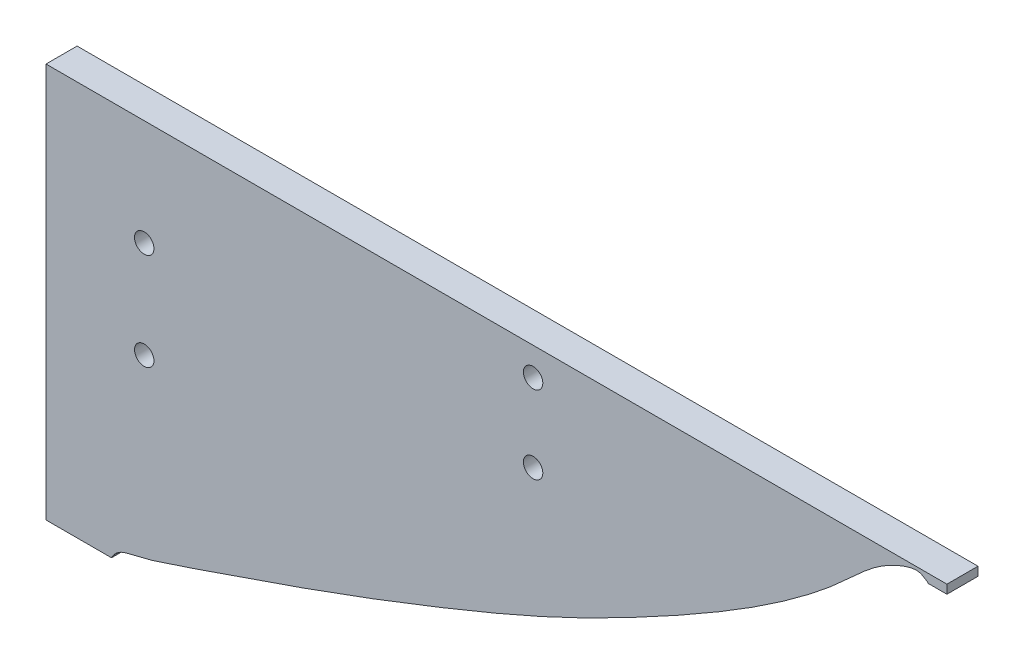
ISO-10303-21;
HEADER;
FILE_DESCRIPTION(('STEP AP214'),'2;1');
FILE_NAME('part.step','',(''),(''),'','','');
FILE_SCHEMA(('AUTOMOTIVE_DESIGN { 1 0 10303 214 1 1 1 1 }'));
ENDSEC;
DATA;
#1=APPLICATION_CONTEXT('core data for automotive mechanical design processes');
#2=APPLICATION_PROTOCOL_DEFINITION('international standard','automotive_design',2000,#1);
#3=PRODUCT_CONTEXT('',#1,'mechanical');
#4=PRODUCT('Part','Part','',(#3));
#5=PRODUCT_RELATED_PRODUCT_CATEGORY('part','',(#4));
#6=PRODUCT_DEFINITION_FORMATION('','',#4);
#7=PRODUCT_DEFINITION_CONTEXT('part definition',#1,'design');
#8=PRODUCT_DEFINITION('design','',#6,#7);
#9=PRODUCT_DEFINITION_SHAPE('','',#8);
#10=(LENGTH_UNIT() NAMED_UNIT(*) SI_UNIT(.MILLI.,.METRE.));
#11=(NAMED_UNIT(*) PLANE_ANGLE_UNIT() SI_UNIT($,.RADIAN.));
#12=(NAMED_UNIT(*) SI_UNIT($,.STERADIAN.) SOLID_ANGLE_UNIT());
#13=UNCERTAINTY_MEASURE_WITH_UNIT(LENGTH_MEASURE(1.E-05),#10,'distance_accuracy_value','');
#14=(GEOMETRIC_REPRESENTATION_CONTEXT(3) GLOBAL_UNCERTAINTY_ASSIGNED_CONTEXT((#13)) GLOBAL_UNIT_ASSIGNED_CONTEXT((#10,
#11,#12)) REPRESENTATION_CONTEXT('',''));
#15=CARTESIAN_POINT('',(0.,0.,0.));
#16=DIRECTION('',(0.,0.,1.));
#17=DIRECTION('',(1.,0.,0.));
#18=AXIS2_PLACEMENT_3D('',#15,#16,#17);
#19=CARTESIAN_POINT('',(1.38467628251213,-57.519694356409,156.));
#20=DIRECTION('',(0.,0.,-1.));
#21=DIRECTION('',(-1.,0.,0.));
#22=AXIS2_PLACEMENT_3D('',#19,#20,#21);
#23=PLANE('',#22);
#24=CARTESIAN_POINT('',(-100.,-50.,156.));
#25=DIRECTION('',(0.,0.,-1.));
#26=DIRECTION('',(-1.,0.,0.));
#27=AXIS2_PLACEMENT_3D('',#24,#25,#26);
#28=CIRCLE('',#27,2.5);
#29=CARTESIAN_POINT('',(-102.5,-50.,156.));
#30=VERTEX_POINT('',#29);
#31=EDGE_CURVE('E242',#30,#30,#28,.F.);
#32=ORIENTED_EDGE('',*,*,#31,.F.);
#33=EDGE_LOOP('',(#32));
#34=FACE_BOUND('',#33,.T.);
#35=CARTESIAN_POINT('',(0.0705666698621599,-4.96037406111782,156.));
#36=DIRECTION('',(0.,0.,-1.));
#37=DIRECTION('',(-1.,0.,0.));
#38=AXIS2_PLACEMENT_3D('',#35,#36,#37);
#39=CIRCLE('',#38,2.5);
#40=CARTESIAN_POINT('',(-2.42943333013784,-4.96037406111782,156.));
#41=VERTEX_POINT('',#40);
#42=EDGE_CURVE('E238',#41,#41,#39,.F.);
#43=ORIENTED_EDGE('',*,*,#42,.F.);
#44=EDGE_LOOP('',(#43));
#45=FACE_BOUND('',#44,.T.);
#46=CARTESIAN_POINT('',(101.738300139448,0.,156.));
#47=CARTESIAN_POINT('',(101.701496361419,0.06988973009756,156.));
#48=CARTESIAN_POINT('',(101.653650032581,0.133217944994193,156.));
#49=CARTESIAN_POINT('',(101.544895418378,0.24446647998401,156.));
#50=CARTESIAN_POINT('',(101.483294070726,0.293946423536007,156.));
#51=CARTESIAN_POINT('',(101.291066930551,0.430804283859788,156.));
#52=CARTESIAN_POINT('',(101.155515527028,0.509659958586335,156.));
#53=CARTESIAN_POINT('',(100.885753846964,0.669615509651436,156.));
#54=CARTESIAN_POINT('',(100.75259774972,0.752479417964117,156.));
#55=CARTESIAN_POINT('',(100.482899372572,0.912540898226803,156.));
#56=CARTESIAN_POINT('',(100.345639381759,0.988603464500231,156.));
#57=CARTESIAN_POINT('',(100.063852301763,1.12830204575235,156.));
#58=CARTESIAN_POINT('',(99.9210179481655,1.19185210345175,156.));
#59=CARTESIAN_POINT('',(99.6279774840183,1.29502595714121,156.));
#60=CARTESIAN_POINT('',(99.477461202732,1.33364304248169,156.));
#61=CARTESIAN_POINT('',(99.1692964096003,1.38772837414857,156.));
#62=CARTESIAN_POINT('',(99.0112200347358,1.4031052945355,156.));
#63=CARTESIAN_POINT('',(98.6988570431695,1.41462659462545,156.));
#64=CARTESIAN_POINT('',(98.5432363651441,1.41109384861551,156.));
#65=CARTESIAN_POINT('',(98.0775590466803,1.38086350862981,156.));
#66=CARTESIAN_POINT('',(97.7679244188163,1.33493500583158,156.));
#67=CARTESIAN_POINT('',(97.1535321885674,1.21574105479129,156.));
#68=CARTESIAN_POINT('',(96.8508770142768,1.14387408795452,156.));
#69=CARTESIAN_POINT('',(95.9546967782744,0.896428384166549,156.));
#70=CARTESIAN_POINT('',(95.372911997121,0.689126454648643,156.));
#71=CARTESIAN_POINT('',(94.2238206411409,0.235401305023569,156.));
#72=CARTESIAN_POINT('',(93.6569799005288,-0.0122806370038444,156.));
#73=CARTESIAN_POINT('',(92.5371792416302,-0.545151631509203,156.));
#74=CARTESIAN_POINT('',(91.9836040653176,-0.830085799385408,156.));
#75=CARTESIAN_POINT('',(90.360358855196,-1.72532159182748,156.));
#76=CARTESIAN_POINT('',(89.3225671754566,-2.38073907298001,156.));
#77=CARTESIAN_POINT('',(86.3383460725468,-4.51754122780541,156.));
#78=CARTESIAN_POINT('',(84.5115464224696,-6.15689881237222,156.));
#79=CARTESIAN_POINT('',(81.7996498653415,-8.65330961722393,156.));
#80=CARTESIAN_POINT('',(80.8992938738056,-9.49018881707652,156.));
#81=CARTESIAN_POINT('',(79.081527180443,-11.1417224289756,156.));
#82=CARTESIAN_POINT('',(78.1659599858207,-11.9587949893637,156.));
#83=CARTESIAN_POINT('',(75.3834025951578,-14.3633719941032,156.));
#84=CARTESIAN_POINT('',(73.4783512478766,-15.901367084239,156.));
#85=CARTESIAN_POINT('',(69.6022773876519,-18.8915429971448,156.));
#86=CARTESIAN_POINT('',(67.6316513689175,-20.344239573422,156.));
#87=CARTESIAN_POINT('',(63.641475930029,-23.1859939254836,156.));
#88=CARTESIAN_POINT('',(61.6212706236731,-24.5741985346864,156.));
#89=CARTESIAN_POINT('',(57.5306040541092,-27.2852355851952,156.));
#90=CARTESIAN_POINT('',(55.4613177881015,-28.6084261149727,156.));
#91=CARTESIAN_POINT('',(51.2917632403158,-31.1992421302028,156.));
#92=CARTESIAN_POINT('',(49.1904842273012,-32.4677513343181,156.));
#93=CARTESIAN_POINT('',(44.9643798012462,-34.9663877282194,156.));
#94=CARTESIAN_POINT('',(42.8394776411478,-36.1962370655212,156.));
#95=CARTESIAN_POINT('',(36.4374256172386,-39.8354492264472,156.));
#96=CARTESIAN_POINT('',(32.1311178506682,-42.195499281144,156.));
#97=CARTESIAN_POINT('',(23.46111164709,-46.8016861693649,156.));
#98=CARTESIAN_POINT('',(19.0982984410697,-49.049764622174,156.));
#99=CARTESIAN_POINT('',(10.2995504860633,-53.401269748828,156.));
#100=CARTESIAN_POINT('',(5.85967663575825,-55.5009424117576,156.));
#101=CARTESIAN_POINT('',(-3.09032407073432,-59.5384463010606,156.));
#102=CARTESIAN_POINT('',(-7.59938739338839,-61.4775148103721,156.));
#103=CARTESIAN_POINT('',(-16.661176991931,-65.2535111709338,156.));
#104=CARTESIAN_POINT('',(-21.2127032080176,-67.0942874665058,156.));
#105=CARTESIAN_POINT('',(-30.3380342543462,-70.7181338355998,156.));
#106=CARTESIAN_POINT('',(-34.9125126821509,-72.4993157921662,156.));
#107=CARTESIAN_POINT('',(-44.0895554117789,-75.9885906317376,156.));
#108=CARTESIAN_POINT('',(-48.692821522079,-77.6956410283187,156.));
#109=CARTESIAN_POINT('',(-57.9264730839638,-81.0351756626081,156.));
#110=CARTESIAN_POINT('',(-62.5565507340367,-82.6680262706488,156.));
#111=CARTESIAN_POINT('',(-71.8296905464721,-85.8966098990169,156.));
#112=CARTESIAN_POINT('',(-76.4721582095824,-87.4939430193638,156.));
#113=CARTESIAN_POINT('',(-83.4382823606628,-89.8827895119961,156.));
#114=CARTESIAN_POINT('',(-85.7608636577338,-90.6775175705849,156.));
#115=CARTESIAN_POINT('',(-89.2477560047578,-91.8606894953403,156.));
#116=CARTESIAN_POINT('',(-90.4105713405755,-92.2535504922505,156.));
#117=CARTESIAN_POINT('',(-92.7372684489331,-93.0361226293404,156.));
#118=CARTESIAN_POINT('',(-93.9002183914828,-93.4288209220981,156.));
#119=CARTESIAN_POINT('',(-96.2325008459889,-94.1934608542043,156.));
#120=CARTESIAN_POINT('',(-97.4030022758043,-94.5616647232957,156.));
#121=CARTESIAN_POINT('',(-99.1752946370308,-95.0604217991858,156.));
#122=CARTESIAN_POINT('',(-99.7687049951259,-95.218106999013,156.));
#123=CARTESIAN_POINT('',(-100.96138279529,-95.5145151683352,156.));
#124=CARTESIAN_POINT('',(-101.561512302162,-95.6504472146611,156.));
#125=CARTESIAN_POINT('',(-102.764822783242,-95.9124322229861,156.));
#126=CARTESIAN_POINT('',(-103.366716320795,-96.0426532437868,156.));
#127=CARTESIAN_POINT('',(-104.257654367546,-96.2765181797679,156.));
#128=CARTESIAN_POINT('',(-104.552729709915,-96.3606373539355,156.));
#129=CARTESIAN_POINT('',(-105.13680880654,-96.5485323868626,156.));
#130=CARTESIAN_POINT('',(-105.425814397407,-96.6523022996169,156.));
#131=CARTESIAN_POINT('',(-105.992429553856,-96.8967366032174,156.));
#132=CARTESIAN_POINT('',(-106.270150393058,-97.0370407472195,156.));
#133=CARTESIAN_POINT('',(-106.672485728994,-97.2936179462777,156.));
#134=CARTESIAN_POINT('',(-106.805196574569,-97.3877756434122,156.));
#135=CARTESIAN_POINT('',(-107.056576468348,-97.5900041622595,156.));
#136=CARTESIAN_POINT('',(-107.175709194497,-97.6983978496301,156.));
#137=CARTESIAN_POINT('',(-107.405530819354,-97.9245590484168,156.));
#138=CARTESIAN_POINT('',(-107.516420949728,-98.0424891132594,156.));
#139=CARTESIAN_POINT('',(-107.728504761563,-98.2861727981688,156.));
#140=CARTESIAN_POINT('',(-107.829804122191,-98.412018578488,156.));
#141=CARTESIAN_POINT('',(-108.032391465187,-98.663719745328,156.));
#142=CARTESIAN_POINT('',(-108.132987964967,-98.7901153042904,156.));
#143=CARTESIAN_POINT('',(-108.266857319462,-98.9907294054731,156.));
#144=CARTESIAN_POINT('',(-108.308508067022,-99.0595353432219,156.));
#145=CARTESIAN_POINT('',(-108.378079796442,-99.2060832518732,156.));
#146=CARTESIAN_POINT('',(-108.405817808476,-99.2844126857894,156.));
#147=CARTESIAN_POINT('',(-108.420640463495,-99.3641801059254,156.));
#148=B_SPLINE_CURVE_WITH_KNOTS('',3,(#46,#47,#48,#49,#50,#51,#52,#53,#54,#55,#56,#57,#58,#59,
#60,#61,#62,#63,#64,#65,#66,#67,#68,#69,#70,#71,#72,#73,#74,#75,#76,#77,#78,#79,#80,#81,#82,#83,
#84,#85,#86,#87,#88,#89,#90,#91,#92,#93,#94,#95,#96,#97,#98,#99,#100,#101,#102,#103,#104,#105,
#106,#107,#108,#109,#110,#111,#112,#113,#114,#115,#116,#117,#118,#119,#120,#121,#122,#123,#124,
#125,#126,#127,#128,#129,#130,#131,#132,#133,#134,#135,#136,#137,#138,#139,#140,#141,#142,#143,
#144,#145,#146,#147),.UNSPECIFIED.,.F.,.F.,(4,2,2,2,2,2,2,2,2,2,2,2,2,2,2,2,2,2,2,2,2,2,2,2,2,2,
2,2,2,2,2,2,2,2,2,2,2,2,2,2,2,2,2,2,2,2,2,2,2,2,4),(0.,0.000976562500000111,0.00195312500000022,
0.00390625000000044,0.00585937500000056,0.00781250000000067,0.00976562500000078,
0.0117187500000009,0.0136718750000011,0.0156250000000012,0.0195312500000013,0.0234375000000014,
0.0312500000000014,0.0390625000000014,0.0468750000000014,0.0625000000000014,0.0937500000000016,
0.109375000000002,0.125000000000002,0.156250000000001,0.187500000000001,0.218750000000001,
0.250000000000001,0.281250000000001,0.312500000000001,0.375000000000001,0.437500000000001,
0.500000000000001,0.562500000000001,0.625000000000001,0.6875,0.75,0.8125,0.875,0.90625,0.921875,
0.9375,0.953125,0.9609375,0.96875,0.9765625,0.98046875,0.984375,0.98828125,0.990234375,
0.9921875,0.994140625,0.99609375,0.998046875,0.9990234375,1.),.UNSPECIFIED.);
#149=CARTESIAN_POINT('',(-108.420640463495,-99.3641801059254,156.));
#150=VERTEX_POINT('',#149);
#151=CARTESIAN_POINT('',(101.738300139448,0.,156.));
#152=VERTEX_POINT('',#151);
#153=EDGE_CURVE('E196',#150,#152,#148,.F.);
#154=ORIENTED_EDGE('',*,*,#153,.T.);
#155=DIRECTION('',(1.,0.,0.));
#156=VECTOR('',#155,1.);
#157=CARTESIAN_POINT('',(101.738300139448,0.,156.));
#158=LINE('',#157,#156);
#159=CARTESIAN_POINT('',(106.563589290346,0.,156.));
#160=VERTEX_POINT('',#159);
#161=EDGE_CURVE('E90',#152,#160,#158,.T.);
#162=ORIENTED_EDGE('',*,*,#161,.T.);
#163=DIRECTION('',(0.,1.,0.));
#164=VECTOR('',#163,1.);
#165=CARTESIAN_POINT('',(106.563589290346,2.25600000000004,156.));
#166=LINE('',#165,#164);
#167=CARTESIAN_POINT('',(106.563589290346,2.25600000000004,156.));
#168=VERTEX_POINT('',#167);
#169=EDGE_CURVE('E103',#160,#168,#166,.T.);
#170=ORIENTED_EDGE('',*,*,#169,.T.);
#171=DIRECTION('',(-1.,0.,0.));
#172=VECTOR('',#171,1.);
#173=CARTESIAN_POINT('',(106.563589290346,2.25600000000004,156.));
#174=LINE('',#173,#172);
#175=CARTESIAN_POINT('',(-125.279213684973,2.25600000000001,156.));
#176=VERTEX_POINT('',#175);
#177=EDGE_CURVE('E97',#168,#176,#174,.T.);
#178=ORIENTED_EDGE('',*,*,#177,.T.);
#179=DIRECTION('',(0.,-1.,0.));
#180=VECTOR('',#179,1.);
#181=CARTESIAN_POINT('',(-125.279213684973,-99.3690234179729,156.));
#182=LINE('',#181,#180);
#183=CARTESIAN_POINT('',(-125.279213684973,-99.3690234179729,156.));
#184=VERTEX_POINT('',#183);
#185=EDGE_CURVE('E101',#176,#184,#182,.T.);
#186=ORIENTED_EDGE('',*,*,#185,.T.);
#187=CARTESIAN_POINT('',(-108.420640463495,-99.3641801059254,156.));
#188=CARTESIAN_POINT('',(-114.040164709387,-99.3662822244313,156.));
#189=CARTESIAN_POINT('',(-119.659689167235,-99.3678556807454,156.));
#190=CARTESIAN_POINT('',(-125.279213684973,-99.3690234179728,156.));
#191=B_SPLINE_CURVE_WITH_KNOTS('',3,(#187,#188,#189,#190),.UNSPECIFIED.,.F.,.F.,(4,4),(0.,1.),.UNSPECIFIED.);
#192=EDGE_CURVE('E51',#184,#150,#191,.F.);
#193=ORIENTED_EDGE('',*,*,#192,.T.);
#194=EDGE_LOOP('',(#154,#162,#170,#178,#186,#193));
#195=FACE_BOUND('',#194,.T.);
#196=CARTESIAN_POINT('',(0.0705666698621599,-25.,156.));
#197=DIRECTION('',(0.,0.,-1.));
#198=DIRECTION('',(-1.,0.,0.));
#199=AXIS2_PLACEMENT_3D('',#196,#197,#198);
#200=CIRCLE('',#199,2.5);
#201=CARTESIAN_POINT('',(-2.42943333013784,-25.,156.));
#202=VERTEX_POINT('',#201);
#203=EDGE_CURVE('E239',#202,#202,#200,.F.);
#204=ORIENTED_EDGE('',*,*,#203,.F.);
#205=EDGE_LOOP('',(#204));
#206=FACE_BOUND('',#205,.T.);
#207=CARTESIAN_POINT('',(-100.,-25.,156.));
#208=DIRECTION('',(0.,0.,-1.));
#209=DIRECTION('',(-1.,0.,0.));
#210=AXIS2_PLACEMENT_3D('',#207,#208,#209);
#211=CIRCLE('',#210,2.5);
#212=CARTESIAN_POINT('',(-102.5,-25.,156.));
#213=VERTEX_POINT('',#212);
#214=EDGE_CURVE('E245',#213,#213,#211,.F.);
#215=ORIENTED_EDGE('',*,*,#214,.F.);
#216=EDGE_LOOP('',(#215));
#217=FACE_BOUND('',#216,.T.);
#218=ADVANCED_FACE('F30',(#34,#45,#195,#206,#217),#23,.F.);
#219=CARTESIAN_POINT('',(1.38467628251213,-57.519694356409,148.));
#220=DIRECTION('',(0.,0.,-1.));
#221=DIRECTION('',(-1.,0.,0.));
#222=AXIS2_PLACEMENT_3D('',#219,#220,#221);
#223=PLANE('',#222);
#224=CARTESIAN_POINT('',(-100.,-50.,148.));
#225=DIRECTION('',(0.,0.,-1.));
#226=DIRECTION('',(-1.,0.,0.));
#227=AXIS2_PLACEMENT_3D('',#224,#225,#226);
#228=CIRCLE('',#227,2.5);
#229=CARTESIAN_POINT('',(-102.5,-50.,148.));
#230=VERTEX_POINT('',#229);
#231=EDGE_CURVE('E243',#230,#230,#228,.F.);
#232=ORIENTED_EDGE('',*,*,#231,.T.);
#233=EDGE_LOOP('',(#232));
#234=FACE_BOUND('',#233,.T.);
#235=CARTESIAN_POINT('',(0.0705666698621599,-4.96037406111782,148.));
#236=DIRECTION('',(0.,0.,-1.));
#237=DIRECTION('',(-1.,0.,0.));
#238=AXIS2_PLACEMENT_3D('',#235,#236,#237);
#239=CIRCLE('',#238,2.5);
#240=CARTESIAN_POINT('',(-2.42943333013784,-4.96037406111782,148.));
#241=VERTEX_POINT('',#240);
#242=EDGE_CURVE('E235',#241,#241,#239,.F.);
#243=ORIENTED_EDGE('',*,*,#242,.T.);
#244=EDGE_LOOP('',(#243));
#245=FACE_BOUND('',#244,.T.);
#246=CARTESIAN_POINT('',(-108.420640463495,-99.3641801059254,148.));
#247=CARTESIAN_POINT('',(-108.405817808476,-99.2844126857894,148.));
#248=CARTESIAN_POINT('',(-108.378079796442,-99.2060832518732,148.));
#249=CARTESIAN_POINT('',(-108.308508067022,-99.0595353432219,148.));
#250=CARTESIAN_POINT('',(-108.266857319462,-98.9907294054731,148.));
#251=CARTESIAN_POINT('',(-108.132987964967,-98.7901153042904,148.));
#252=CARTESIAN_POINT('',(-108.032391465187,-98.663719745328,148.));
#253=CARTESIAN_POINT('',(-107.829804122191,-98.412018578488,148.));
#254=CARTESIAN_POINT('',(-107.728504761563,-98.2861727981688,148.));
#255=CARTESIAN_POINT('',(-107.516420949728,-98.0424891132594,148.));
#256=CARTESIAN_POINT('',(-107.405530819354,-97.9245590484168,148.));
#257=CARTESIAN_POINT('',(-107.175709194497,-97.6983978496301,148.));
#258=CARTESIAN_POINT('',(-107.056576468348,-97.5900041622595,148.));
#259=CARTESIAN_POINT('',(-106.805196574569,-97.3877756434122,148.));
#260=CARTESIAN_POINT('',(-106.672485728994,-97.2936179462777,148.));
#261=CARTESIAN_POINT('',(-106.270150393058,-97.0370407472195,148.));
#262=CARTESIAN_POINT('',(-105.992429553856,-96.8967366032174,148.));
#263=CARTESIAN_POINT('',(-105.425814397407,-96.6523022996169,148.));
#264=CARTESIAN_POINT('',(-105.13680880654,-96.5485323868626,148.));
#265=CARTESIAN_POINT('',(-104.552729709915,-96.3606373539355,148.));
#266=CARTESIAN_POINT('',(-104.257654367546,-96.2765181797679,148.));
#267=CARTESIAN_POINT('',(-103.366716320795,-96.0426532437868,148.));
#268=CARTESIAN_POINT('',(-102.764822783242,-95.9124322229861,148.));
#269=CARTESIAN_POINT('',(-101.561512302162,-95.6504472146611,148.));
#270=CARTESIAN_POINT('',(-100.96138279529,-95.5145151683352,148.));
#271=CARTESIAN_POINT('',(-99.7687049951259,-95.218106999013,148.));
#272=CARTESIAN_POINT('',(-99.1752946370308,-95.0604217991858,148.));
#273=CARTESIAN_POINT('',(-97.4030022758043,-94.5616647232957,148.));
#274=CARTESIAN_POINT('',(-96.2325008459889,-94.1934608542043,148.));
#275=CARTESIAN_POINT('',(-93.9002183914828,-93.4288209220981,148.));
#276=CARTESIAN_POINT('',(-92.7372684489331,-93.0361226293404,148.));
#277=CARTESIAN_POINT('',(-90.4105713405755,-92.2535504922505,148.));
#278=CARTESIAN_POINT('',(-89.2477560047578,-91.8606894953403,148.));
#279=CARTESIAN_POINT('',(-85.7608636577338,-90.6775175705849,148.));
#280=CARTESIAN_POINT('',(-83.4382823606628,-89.8827895119961,148.));
#281=CARTESIAN_POINT('',(-76.4721582095824,-87.4939430193638,148.));
#282=CARTESIAN_POINT('',(-71.8296905464721,-85.8966098990169,148.));
#283=CARTESIAN_POINT('',(-62.5565507340367,-82.6680262706488,148.));
#284=CARTESIAN_POINT('',(-57.9264730839638,-81.0351756626081,148.));
#285=CARTESIAN_POINT('',(-48.692821522079,-77.6956410283187,148.));
#286=CARTESIAN_POINT('',(-44.0895554117789,-75.9885906317376,148.));
#287=CARTESIAN_POINT('',(-34.9125126821509,-72.4993157921662,148.));
#288=CARTESIAN_POINT('',(-30.3380342543462,-70.7181338355998,148.));
#289=CARTESIAN_POINT('',(-21.2127032080176,-67.0942874665058,148.));
#290=CARTESIAN_POINT('',(-16.661176991931,-65.2535111709338,148.));
#291=CARTESIAN_POINT('',(-7.59938739338839,-61.4775148103721,148.));
#292=CARTESIAN_POINT('',(-3.09032407073432,-59.5384463010606,148.));
#293=CARTESIAN_POINT('',(5.85967663575825,-55.5009424117576,148.));
#294=CARTESIAN_POINT('',(10.2995504860633,-53.401269748828,148.));
#295=CARTESIAN_POINT('',(19.0982984410697,-49.049764622174,148.));
#296=CARTESIAN_POINT('',(23.46111164709,-46.8016861693649,148.));
#297=CARTESIAN_POINT('',(32.1311178506682,-42.195499281144,148.));
#298=CARTESIAN_POINT('',(36.4374256172386,-39.8354492264472,148.));
#299=CARTESIAN_POINT('',(42.8394776411478,-36.1962370655212,148.));
#300=CARTESIAN_POINT('',(44.9643798012462,-34.9663877282194,148.));
#301=CARTESIAN_POINT('',(49.1904842273012,-32.4677513343181,148.));
#302=CARTESIAN_POINT('',(51.2917632403158,-31.1992421302028,148.));
#303=CARTESIAN_POINT('',(55.4613177881015,-28.6084261149727,148.));
#304=CARTESIAN_POINT('',(57.5306040541092,-27.2852355851952,148.));
#305=CARTESIAN_POINT('',(61.6212706236731,-24.5741985346864,148.));
#306=CARTESIAN_POINT('',(63.641475930029,-23.1859939254836,148.));
#307=CARTESIAN_POINT('',(67.6316513689175,-20.344239573422,148.));
#308=CARTESIAN_POINT('',(69.6022773876519,-18.8915429971448,148.));
#309=CARTESIAN_POINT('',(73.4783512478766,-15.901367084239,148.));
#310=CARTESIAN_POINT('',(75.3834025951578,-14.3633719941032,148.));
#311=CARTESIAN_POINT('',(78.1659599858207,-11.9587949893637,148.));
#312=CARTESIAN_POINT('',(79.081527180443,-11.1417224289756,148.));
#313=CARTESIAN_POINT('',(80.8992938738056,-9.49018881707652,148.));
#314=CARTESIAN_POINT('',(81.7996498653415,-8.65330961722393,148.));
#315=CARTESIAN_POINT('',(84.5115464224696,-6.15689881237222,148.));
#316=CARTESIAN_POINT('',(86.3383460725468,-4.51754122780541,148.));
#317=CARTESIAN_POINT('',(89.3225671754566,-2.38073907298001,148.));
#318=CARTESIAN_POINT('',(90.360358855196,-1.72532159182748,148.));
#319=CARTESIAN_POINT('',(91.9836040653176,-0.830085799385408,148.));
#320=CARTESIAN_POINT('',(92.5371792416302,-0.545151631509203,148.));
#321=CARTESIAN_POINT('',(93.6569799005288,-0.0122806370038444,148.));
#322=CARTESIAN_POINT('',(94.2238206411409,0.235401305023569,148.));
#323=CARTESIAN_POINT('',(95.372911997121,0.689126454648643,148.));
#324=CARTESIAN_POINT('',(95.9546967782744,0.896428384166549,148.));
#325=CARTESIAN_POINT('',(96.8508770142768,1.14387408795452,148.));
#326=CARTESIAN_POINT('',(97.1535321885674,1.21574105479129,148.));
#327=CARTESIAN_POINT('',(97.7679244188163,1.33493500583158,148.));
#328=CARTESIAN_POINT('',(98.0775590466803,1.38086350862981,148.));
#329=CARTESIAN_POINT('',(98.5432363651441,1.41109384861551,148.));
#330=CARTESIAN_POINT('',(98.6988570431695,1.41462659462545,148.));
#331=CARTESIAN_POINT('',(99.0112200347358,1.4031052945355,148.));
#332=CARTESIAN_POINT('',(99.1692964096003,1.38772837414857,148.));
#333=CARTESIAN_POINT('',(99.477461202732,1.33364304248169,148.));
#334=CARTESIAN_POINT('',(99.6279774840183,1.29502595714121,148.));
#335=CARTESIAN_POINT('',(99.9210179481655,1.19185210345175,148.));
#336=CARTESIAN_POINT('',(100.063852301763,1.12830204575235,148.));
#337=CARTESIAN_POINT('',(100.345639381759,0.988603464500231,148.));
#338=CARTESIAN_POINT('',(100.482899372572,0.912540898226803,148.));
#339=CARTESIAN_POINT('',(100.75259774972,0.752479417964117,148.));
#340=CARTESIAN_POINT('',(100.885753846964,0.669615509651436,148.));
#341=CARTESIAN_POINT('',(101.155515527028,0.509659958586335,148.));
#342=CARTESIAN_POINT('',(101.291066930551,0.430804283859788,148.));
#343=CARTESIAN_POINT('',(101.483294070726,0.293946423536007,148.));
#344=CARTESIAN_POINT('',(101.544895418378,0.24446647998401,148.));
#345=CARTESIAN_POINT('',(101.653650032581,0.133217944994193,148.));
#346=CARTESIAN_POINT('',(101.701496361419,0.06988973009756,148.));
#347=CARTESIAN_POINT('',(101.738300139448,0.,148.));
#348=B_SPLINE_CURVE_WITH_KNOTS('',3,(#246,#247,#248,#249,#250,#251,#252,#253,#254,#255,#256,
#257,#258,#259,#260,#261,#262,#263,#264,#265,#266,#267,#268,#269,#270,#271,#272,#273,#274,#275,
#276,#277,#278,#279,#280,#281,#282,#283,#284,#285,#286,#287,#288,#289,#290,#291,#292,#293,#294,
#295,#296,#297,#298,#299,#300,#301,#302,#303,#304,#305,#306,#307,#308,#309,#310,#311,#312,#313,
#314,#315,#316,#317,#318,#319,#320,#321,#322,#323,#324,#325,#326,#327,#328,#329,#330,#331,#332,
#333,#334,#335,#336,#337,#338,#339,#340,#341,#342,#343,#344,#345,#346,#347),.UNSPECIFIED.,.F.,
.F.,(4,2,2,2,2,2,2,2,2,2,2,2,2,2,2,2,2,2,2,2,2,2,2,2,2,2,2,2,2,2,2,2,2,2,2,2,2,2,2,2,2,2,2,2,2,
2,2,2,2,2,4),(0.,0.0009765625,0.001953125,0.00390625,0.00585937499999989,0.00781249999999989,
0.00976562499999978,0.0117187499999998,0.0156249999999999,0.01953125,0.0234375000000001,0.03125,
0.0390625,0.046875,0.0625,0.078125,0.0937499999999999,0.125,0.1875,0.25,0.3125,
0.374999999999999,0.437499999999999,0.499999999999999,0.562499999999999,0.624999999999999,
0.687499999999999,0.718749999999999,0.749999999999999,0.781249999999999,0.812499999999999,
0.843749999999999,0.874999999999998,0.890624999999998,0.906249999999998,0.937499999999999,
0.953124999999999,0.960937499999999,0.968749999999999,0.976562499999999,0.980468749999999,
0.984374999999999,0.986328124999999,0.988281249999999,0.990234374999999,0.992187499999999,
0.994140624999999,0.99609375,0.998046875,0.9990234375,1.),.UNSPECIFIED.);
#349=CARTESIAN_POINT('',(-108.420640463495,-99.3641801059254,148.));
#350=VERTEX_POINT('',#349);
#351=CARTESIAN_POINT('',(101.738300139448,0.,148.));
#352=VERTEX_POINT('',#351);
#353=EDGE_CURVE('E213',#350,#352,#348,.T.);
#354=ORIENTED_EDGE('',*,*,#353,.F.);
#355=CARTESIAN_POINT('',(-125.279213684973,-99.3690234179728,148.));
#356=CARTESIAN_POINT('',(-119.659689167235,-99.3678556807454,148.));
#357=CARTESIAN_POINT('',(-114.040164709387,-99.3662822244313,148.));
#358=CARTESIAN_POINT('',(-108.420640463495,-99.3641801059254,148.));
#359=B_SPLINE_CURVE_WITH_KNOTS('',3,(#355,#356,#357,#358),.UNSPECIFIED.,.F.,.F.,(4,4),(0.,1.),.UNSPECIFIED.);
#360=CARTESIAN_POINT('',(-125.279213684973,-99.3690234179729,148.));
#361=VERTEX_POINT('',#360);
#362=EDGE_CURVE('E81',#361,#350,#359,.T.);
#363=ORIENTED_EDGE('',*,*,#362,.F.);
#364=DIRECTION('',(0.,-1.,0.));
#365=VECTOR('',#364,1.);
#366=CARTESIAN_POINT('',(-125.279213684973,-99.3690234179729,148.));
#367=LINE('',#366,#365);
#368=CARTESIAN_POINT('',(-125.279213684973,2.25600000000001,148.));
#369=VERTEX_POINT('',#368);
#370=EDGE_CURVE('E75',#369,#361,#367,.T.);
#371=ORIENTED_EDGE('',*,*,#370,.F.);
#372=DIRECTION('',(-1.,0.,0.));
#373=VECTOR('',#372,1.);
#374=CARTESIAN_POINT('',(106.563589290346,2.25600000000004,148.));
#375=LINE('',#374,#373);
#376=CARTESIAN_POINT('',(106.563589290346,2.25600000000004,148.));
#377=VERTEX_POINT('',#376);
#378=EDGE_CURVE('E111',#377,#369,#375,.T.);
#379=ORIENTED_EDGE('',*,*,#378,.F.);
#380=DIRECTION('',(0.,1.,0.));
#381=VECTOR('',#380,1.);
#382=CARTESIAN_POINT('',(106.563589290346,2.25600000000004,148.));
#383=LINE('',#382,#381);
#384=CARTESIAN_POINT('',(106.563589290346,0.,148.));
#385=VERTEX_POINT('',#384);
#386=EDGE_CURVE('E158',#385,#377,#383,.T.);
#387=ORIENTED_EDGE('',*,*,#386,.F.);
#388=DIRECTION('',(1.,0.,0.));
#389=VECTOR('',#388,1.);
#390=CARTESIAN_POINT('',(101.738300139448,0.,148.));
#391=LINE('',#390,#389);
#392=EDGE_CURVE('E163',#352,#385,#391,.T.);
#393=ORIENTED_EDGE('',*,*,#392,.F.);
#394=EDGE_LOOP('',(#354,#363,#371,#379,#387,#393));
#395=FACE_BOUND('',#394,.T.);
#396=CARTESIAN_POINT('',(0.0705666698621599,-25.,148.));
#397=DIRECTION('',(0.,0.,-1.));
#398=DIRECTION('',(-1.,0.,0.));
#399=AXIS2_PLACEMENT_3D('',#396,#397,#398);
#400=CIRCLE('',#399,2.5);
#401=CARTESIAN_POINT('',(-2.42943333013784,-25.,148.));
#402=VERTEX_POINT('',#401);
#403=EDGE_CURVE('E240',#402,#402,#400,.F.);
#404=ORIENTED_EDGE('',*,*,#403,.T.);
#405=EDGE_LOOP('',(#404));
#406=FACE_BOUND('',#405,.T.);
#407=CARTESIAN_POINT('',(-100.,-25.,148.));
#408=DIRECTION('',(0.,0.,-1.));
#409=DIRECTION('',(-1.,0.,0.));
#410=AXIS2_PLACEMENT_3D('',#407,#408,#409);
#411=CIRCLE('',#410,2.5);
#412=CARTESIAN_POINT('',(-102.5,-25.,148.));
#413=VERTEX_POINT('',#412);
#414=EDGE_CURVE('E36',#413,#413,#411,.F.);
#415=ORIENTED_EDGE('',*,*,#414,.T.);
#416=EDGE_LOOP('',(#415));
#417=FACE_BOUND('',#416,.T.);
#418=ADVANCED_FACE('F148',(#234,#245,#395,#406,#417),#223,.T.);
#419=CARTESIAN_POINT('',(-108.420640463495,-99.3641801059254,156.));
#420=CARTESIAN_POINT('',(-108.405817808476,-99.2844126857894,156.));
#421=CARTESIAN_POINT('',(-108.378079796442,-99.2060832518732,156.));
#422=CARTESIAN_POINT('',(-108.308508067022,-99.0595353432219,156.));
#423=CARTESIAN_POINT('',(-108.266857319462,-98.9907294054731,156.));
#424=CARTESIAN_POINT('',(-108.132987964967,-98.7901153042904,156.));
#425=CARTESIAN_POINT('',(-108.032391465187,-98.663719745328,156.));
#426=CARTESIAN_POINT('',(-107.829804122191,-98.412018578488,156.));
#427=CARTESIAN_POINT('',(-107.728504761563,-98.2861727981688,156.));
#428=CARTESIAN_POINT('',(-107.516420949728,-98.0424891132594,156.));
#429=CARTESIAN_POINT('',(-107.405530819354,-97.9245590484168,156.));
#430=CARTESIAN_POINT('',(-107.175709194497,-97.6983978496301,156.));
#431=CARTESIAN_POINT('',(-107.056576468348,-97.5900041622595,156.));
#432=CARTESIAN_POINT('',(-106.805196574569,-97.3877756434122,156.));
#433=CARTESIAN_POINT('',(-106.672485728994,-97.2936179462777,156.));
#434=CARTESIAN_POINT('',(-106.270150393058,-97.0370407472195,156.));
#435=CARTESIAN_POINT('',(-105.992429553856,-96.8967366032174,156.));
#436=CARTESIAN_POINT('',(-105.425814397407,-96.6523022996169,156.));
#437=CARTESIAN_POINT('',(-105.13680880654,-96.5485323868626,156.));
#438=CARTESIAN_POINT('',(-104.552729709915,-96.3606373539355,156.));
#439=CARTESIAN_POINT('',(-104.257654367546,-96.2765181797679,156.));
#440=CARTESIAN_POINT('',(-103.366716320795,-96.0426532437868,156.));
#441=CARTESIAN_POINT('',(-102.764822783242,-95.9124322229861,156.));
#442=CARTESIAN_POINT('',(-101.561512302162,-95.6504472146611,156.));
#443=CARTESIAN_POINT('',(-100.96138279529,-95.5145151683352,156.));
#444=CARTESIAN_POINT('',(-99.7687049951259,-95.218106999013,156.));
#445=CARTESIAN_POINT('',(-99.1752946370308,-95.0604217991858,156.));
#446=CARTESIAN_POINT('',(-97.4030022758043,-94.5616647232957,156.));
#447=CARTESIAN_POINT('',(-96.2325008459889,-94.1934608542043,156.));
#448=CARTESIAN_POINT('',(-93.9002183914828,-93.4288209220981,156.));
#449=CARTESIAN_POINT('',(-92.7372684489331,-93.0361226293404,156.));
#450=CARTESIAN_POINT('',(-90.4105713405755,-92.2535504922505,156.));
#451=CARTESIAN_POINT('',(-89.2477560047578,-91.8606894953403,156.));
#452=CARTESIAN_POINT('',(-85.7608636577338,-90.6775175705849,156.));
#453=CARTESIAN_POINT('',(-83.4382823606628,-89.8827895119961,156.));
#454=CARTESIAN_POINT('',(-76.4721582095824,-87.4939430193638,156.));
#455=CARTESIAN_POINT('',(-71.8296905464721,-85.8966098990169,156.));
#456=CARTESIAN_POINT('',(-62.5565507340367,-82.6680262706488,156.));
#457=CARTESIAN_POINT('',(-57.9264730839638,-81.0351756626081,156.));
#458=CARTESIAN_POINT('',(-48.692821522079,-77.6956410283187,156.));
#459=CARTESIAN_POINT('',(-44.0895554117789,-75.9885906317376,156.));
#460=CARTESIAN_POINT('',(-34.9125126821509,-72.4993157921662,156.));
#461=CARTESIAN_POINT('',(-30.3380342543462,-70.7181338355998,156.));
#462=CARTESIAN_POINT('',(-21.2127032080176,-67.0942874665058,156.));
#463=CARTESIAN_POINT('',(-16.661176991931,-65.2535111709338,156.));
#464=CARTESIAN_POINT('',(-7.59938739338839,-61.4775148103721,156.));
#465=CARTESIAN_POINT('',(-3.09032407073432,-59.5384463010606,156.));
#466=CARTESIAN_POINT('',(5.85967663575825,-55.5009424117576,156.));
#467=CARTESIAN_POINT('',(10.2995504860633,-53.401269748828,156.));
#468=CARTESIAN_POINT('',(19.0982984410697,-49.049764622174,156.));
#469=CARTESIAN_POINT('',(23.46111164709,-46.8016861693649,156.));
#470=CARTESIAN_POINT('',(32.1311178506682,-42.195499281144,156.));
#471=CARTESIAN_POINT('',(36.4374256172386,-39.8354492264472,156.));
#472=CARTESIAN_POINT('',(42.8394776411478,-36.1962370655212,156.));
#473=CARTESIAN_POINT('',(44.9643798012462,-34.9663877282194,156.));
#474=CARTESIAN_POINT('',(49.1904842273012,-32.4677513343181,156.));
#475=CARTESIAN_POINT('',(51.2917632403158,-31.1992421302028,156.));
#476=CARTESIAN_POINT('',(55.4613177881015,-28.6084261149727,156.));
#477=CARTESIAN_POINT('',(57.5306040541092,-27.2852355851952,156.));
#478=CARTESIAN_POINT('',(61.6212706236731,-24.5741985346864,156.));
#479=CARTESIAN_POINT('',(63.641475930029,-23.1859939254836,156.));
#480=CARTESIAN_POINT('',(67.6316513689175,-20.344239573422,156.));
#481=CARTESIAN_POINT('',(69.6022773876519,-18.8915429971448,156.));
#482=CARTESIAN_POINT('',(73.4783512478766,-15.901367084239,156.));
#483=CARTESIAN_POINT('',(75.3834025951578,-14.3633719941032,156.));
#484=CARTESIAN_POINT('',(78.1659599858207,-11.9587949893637,156.));
#485=CARTESIAN_POINT('',(79.081527180443,-11.1417224289756,156.));
#486=CARTESIAN_POINT('',(80.8992938738056,-9.49018881707652,156.));
#487=CARTESIAN_POINT('',(81.7996498653415,-8.65330961722393,156.));
#488=CARTESIAN_POINT('',(84.5115464224696,-6.15689881237222,156.));
#489=CARTESIAN_POINT('',(86.3383460725468,-4.51754122780541,156.));
#490=CARTESIAN_POINT('',(89.3225671754566,-2.38073907298001,156.));
#491=CARTESIAN_POINT('',(90.360358855196,-1.72532159182748,156.));
#492=CARTESIAN_POINT('',(91.9836040653176,-0.830085799385408,156.));
#493=CARTESIAN_POINT('',(92.5371792416302,-0.545151631509203,156.));
#494=CARTESIAN_POINT('',(93.6569799005288,-0.0122806370038444,156.));
#495=CARTESIAN_POINT('',(94.2238206411409,0.235401305023569,156.));
#496=CARTESIAN_POINT('',(95.372911997121,0.689126454648643,156.));
#497=CARTESIAN_POINT('',(95.9546967782744,0.896428384166549,156.));
#498=CARTESIAN_POINT('',(96.8508770142768,1.14387408795452,156.));
#499=CARTESIAN_POINT('',(97.1535321885674,1.21574105479129,156.));
#500=CARTESIAN_POINT('',(97.7679244188163,1.33493500583158,156.));
#501=CARTESIAN_POINT('',(98.0775590466803,1.38086350862981,156.));
#502=CARTESIAN_POINT('',(98.5432363651441,1.41109384861551,156.));
#503=CARTESIAN_POINT('',(98.6988570431695,1.41462659462545,156.));
#504=CARTESIAN_POINT('',(99.0112200347358,1.4031052945355,156.));
#505=CARTESIAN_POINT('',(99.1692964096003,1.38772837414857,156.));
#506=CARTESIAN_POINT('',(99.477461202732,1.33364304248169,156.));
#507=CARTESIAN_POINT('',(99.6279774840183,1.29502595714121,156.));
#508=CARTESIAN_POINT('',(99.9210179481655,1.19185210345175,156.));
#509=CARTESIAN_POINT('',(100.063852301763,1.12830204575235,156.));
#510=CARTESIAN_POINT('',(100.345639381759,0.988603464500231,156.));
#511=CARTESIAN_POINT('',(100.482899372572,0.912540898226803,156.));
#512=CARTESIAN_POINT('',(100.75259774972,0.752479417964117,156.));
#513=CARTESIAN_POINT('',(100.885753846964,0.669615509651436,156.));
#514=CARTESIAN_POINT('',(101.155515527028,0.509659958586335,156.));
#515=CARTESIAN_POINT('',(101.291066930551,0.430804283859788,156.));
#516=CARTESIAN_POINT('',(101.483294070726,0.293946423536007,156.));
#517=CARTESIAN_POINT('',(101.544895418378,0.24446647998401,156.));
#518=CARTESIAN_POINT('',(101.653650032581,0.133217944994193,156.));
#519=CARTESIAN_POINT('',(101.701496361419,0.06988973009756,156.));
#520=CARTESIAN_POINT('',(101.738300139448,0.,156.));
#521=B_SPLINE_CURVE_WITH_KNOTS('',3,(#419,#420,#421,#422,#423,#424,#425,#426,#427,#428,#429,
#430,#431,#432,#433,#434,#435,#436,#437,#438,#439,#440,#441,#442,#443,#444,#445,#446,#447,#448,
#449,#450,#451,#452,#453,#454,#455,#456,#457,#458,#459,#460,#461,#462,#463,#464,#465,#466,#467,
#468,#469,#470,#471,#472,#473,#474,#475,#476,#477,#478,#479,#480,#481,#482,#483,#484,#485,#486,
#487,#488,#489,#490,#491,#492,#493,#494,#495,#496,#497,#498,#499,#500,#501,#502,#503,#504,#505,
#506,#507,#508,#509,#510,#511,#512,#513,#514,#515,#516,#517,#518,#519,#520),.UNSPECIFIED.,.F.,
.F.,(4,2,2,2,2,2,2,2,2,2,2,2,2,2,2,2,2,2,2,2,2,2,2,2,2,2,2,2,2,2,2,2,2,2,2,2,2,2,2,2,2,2,2,2,2,
2,2,2,2,2,4),(0.,0.0009765625,0.001953125,0.00390625,0.00585937499999989,0.00781249999999989,
0.00976562499999978,0.0117187499999998,0.0156249999999999,0.01953125,0.0234375000000001,0.03125,
0.0390625,0.046875,0.0625,0.078125,0.0937499999999999,0.125,0.1875,0.25,0.3125,
0.374999999999999,0.437499999999999,0.499999999999999,0.562499999999999,0.624999999999999,
0.687499999999999,0.718749999999999,0.749999999999999,0.781249999999999,0.812499999999999,
0.843749999999999,0.874999999999998,0.890624999999998,0.906249999999998,0.937499999999999,
0.953124999999999,0.960937499999999,0.968749999999999,0.976562499999999,0.980468749999999,
0.984374999999999,0.986328124999999,0.988281249999999,0.990234374999999,0.992187499999999,
0.994140624999999,0.99609375,0.998046875,0.9990234375,1.),.UNSPECIFIED.);
#522=DIRECTION('',(0.,0.,-1.));
#523=VECTOR('',#522,1.);
#524=SURFACE_OF_LINEAR_EXTRUSION('',#521,#523);
#525=ORIENTED_EDGE('',*,*,#353,.T.);
#526=DIRECTION('',(0.,0.,-1.));
#527=VECTOR('',#526,1.);
#528=CARTESIAN_POINT('',(101.738300139448,0.,156.));
#529=LINE('',#528,#527);
#530=EDGE_CURVE('E11',#152,#352,#529,.T.);
#531=ORIENTED_EDGE('',*,*,#530,.F.);
#532=ORIENTED_EDGE('',*,*,#153,.F.);
#533=DIRECTION('',(0.,0.,-1.));
#534=VECTOR('',#533,1.);
#535=CARTESIAN_POINT('',(-108.420640463495,-99.3641801059254,156.));
#536=LINE('',#535,#534);
#537=EDGE_CURVE('E117',#150,#350,#536,.T.);
#538=ORIENTED_EDGE('',*,*,#537,.T.);
#539=EDGE_LOOP('',(#525,#531,#532,#538));
#540=FACE_BOUND('',#539,.T.);
#541=ADVANCED_FACE('F32',(#540),#524,.F.);
#542=CARTESIAN_POINT('',(101.738300139448,0.,156.));
#543=DIRECTION('',(0.,1.,0.));
#544=DIRECTION('',(-1.,0.,0.));
#545=AXIS2_PLACEMENT_3D('',#542,#543,#544);
#546=PLANE('',#545);
#547=ORIENTED_EDGE('',*,*,#392,.T.);
#548=DIRECTION('',(0.,0.,-1.));
#549=VECTOR('',#548,1.);
#550=CARTESIAN_POINT('',(106.563589290346,0.,156.));
#551=LINE('',#550,#549);
#552=EDGE_CURVE('E42',#160,#385,#551,.T.);
#553=ORIENTED_EDGE('',*,*,#552,.F.);
#554=ORIENTED_EDGE('',*,*,#161,.F.);
#555=ORIENTED_EDGE('',*,*,#530,.T.);
#556=EDGE_LOOP('',(#547,#553,#554,#555));
#557=FACE_BOUND('',#556,.T.);
#558=ADVANCED_FACE('F338',(#557),#546,.F.);
#559=CARTESIAN_POINT('',(106.563589290346,2.25600000000004,156.));
#560=DIRECTION('',(-1.,0.,0.));
#561=DIRECTION('',(0.,0.,1.));
#562=AXIS2_PLACEMENT_3D('',#559,#560,#561);
#563=PLANE('',#562);
#564=ORIENTED_EDGE('',*,*,#386,.T.);
#565=DIRECTION('',(0.,0.,-1.));
#566=VECTOR('',#565,1.);
#567=CARTESIAN_POINT('',(106.563589290346,2.25600000000004,156.));
#568=LINE('',#567,#566);
#569=EDGE_CURVE('E112',#168,#377,#568,.T.);
#570=ORIENTED_EDGE('',*,*,#569,.F.);
#571=ORIENTED_EDGE('',*,*,#169,.F.);
#572=ORIENTED_EDGE('',*,*,#552,.T.);
#573=EDGE_LOOP('',(#564,#570,#571,#572));
#574=FACE_BOUND('',#573,.T.);
#575=ADVANCED_FACE('F330',(#574),#563,.F.);
#576=CARTESIAN_POINT('',(106.563589290346,2.25600000000004,156.));
#577=DIRECTION('',(0.,-1.,0.));
#578=DIRECTION('',(1.,0.,0.));
#579=AXIS2_PLACEMENT_3D('',#576,#577,#578);
#580=PLANE('',#579);
#581=ORIENTED_EDGE('',*,*,#378,.T.);
#582=DIRECTION('',(0.,0.,-1.));
#583=VECTOR('',#582,1.);
#584=CARTESIAN_POINT('',(-125.279213684973,2.25600000000001,156.));
#585=LINE('',#584,#583);
#586=EDGE_CURVE('E108',#176,#369,#585,.T.);
#587=ORIENTED_EDGE('',*,*,#586,.F.);
#588=ORIENTED_EDGE('',*,*,#177,.F.);
#589=ORIENTED_EDGE('',*,*,#569,.T.);
#590=EDGE_LOOP('',(#581,#587,#588,#589));
#591=FACE_BOUND('',#590,.T.);
#592=ADVANCED_FACE('F109',(#591),#580,.F.);
#593=CARTESIAN_POINT('',(-125.279213684973,-99.3690234179729,156.));
#594=DIRECTION('',(1.,0.,0.));
#595=DIRECTION('',(0.,0.,-1.));
#596=AXIS2_PLACEMENT_3D('',#593,#594,#595);
#597=PLANE('',#596);
#598=ORIENTED_EDGE('',*,*,#370,.T.);
#599=DIRECTION('',(0.,0.,-1.));
#600=VECTOR('',#599,1.);
#601=CARTESIAN_POINT('',(-125.279213684973,-99.3690234179729,156.));
#602=LINE('',#601,#600);
#603=EDGE_CURVE('E113',#184,#361,#602,.T.);
#604=ORIENTED_EDGE('',*,*,#603,.F.);
#605=ORIENTED_EDGE('',*,*,#185,.F.);
#606=ORIENTED_EDGE('',*,*,#586,.T.);
#607=EDGE_LOOP('',(#598,#604,#605,#606));
#608=FACE_BOUND('',#607,.T.);
#609=ADVANCED_FACE('F115',(#608),#597,.F.);
#610=CARTESIAN_POINT('',(-125.279213684973,-99.3690234179728,156.));
#611=CARTESIAN_POINT('',(-119.659689167235,-99.3678556807454,156.));
#612=CARTESIAN_POINT('',(-114.040164709387,-99.3662822244313,156.));
#613=CARTESIAN_POINT('',(-108.420640463495,-99.3641801059254,156.));
#614=B_SPLINE_CURVE_WITH_KNOTS('',3,(#610,#611,#612,#613),.UNSPECIFIED.,.F.,.F.,(4,4),(0.,1.),.UNSPECIFIED.);
#615=DIRECTION('',(0.,0.,-1.));
#616=VECTOR('',#615,1.);
#617=SURFACE_OF_LINEAR_EXTRUSION('',#614,#616);
#618=ORIENTED_EDGE('',*,*,#362,.T.);
#619=ORIENTED_EDGE('',*,*,#537,.F.);
#620=ORIENTED_EDGE('',*,*,#192,.F.);
#621=ORIENTED_EDGE('',*,*,#603,.T.);
#622=EDGE_LOOP('',(#618,#619,#620,#621));
#623=FACE_BOUND('',#622,.T.);
#624=ADVANCED_FACE('F136',(#623),#617,.F.);
#625=CARTESIAN_POINT('',(0.0705666698621599,-4.96037406111782,308.));
#626=DIRECTION('',(0.,0.,-1.));
#627=DIRECTION('',(-1.,0.,0.));
#628=AXIS2_PLACEMENT_3D('',#625,#626,#627);
#629=CYLINDRICAL_SURFACE('',#628,2.5);
#630=ORIENTED_EDGE('',*,*,#242,.F.);
#631=EDGE_LOOP('',(#630));
#632=FACE_BOUND('',#631,.T.);
#633=ORIENTED_EDGE('',*,*,#42,.T.);
#634=EDGE_LOOP('',(#633));
#635=FACE_BOUND('',#634,.T.);
#636=ADVANCED_FACE('F147',(#632,#635),#629,.F.);
#637=CARTESIAN_POINT('',(0.0705666698621599,-25.,308.));
#638=DIRECTION('',(0.,0.,-1.));
#639=DIRECTION('',(-1.,0.,0.));
#640=AXIS2_PLACEMENT_3D('',#637,#638,#639);
#641=CYLINDRICAL_SURFACE('',#640,2.5);
#642=ORIENTED_EDGE('',*,*,#403,.F.);
#643=EDGE_LOOP('',(#642));
#644=FACE_BOUND('',#643,.T.);
#645=ORIENTED_EDGE('',*,*,#203,.T.);
#646=EDGE_LOOP('',(#645));
#647=FACE_BOUND('',#646,.T.);
#648=ADVANCED_FACE('F269',(#644,#647),#641,.F.);
#649=CARTESIAN_POINT('',(-100.,-50.,308.));
#650=DIRECTION('',(0.,0.,-1.));
#651=DIRECTION('',(-1.,0.,0.));
#652=AXIS2_PLACEMENT_3D('',#649,#650,#651);
#653=CYLINDRICAL_SURFACE('',#652,2.5);
#654=ORIENTED_EDGE('',*,*,#231,.F.);
#655=EDGE_LOOP('',(#654));
#656=FACE_BOUND('',#655,.T.);
#657=ORIENTED_EDGE('',*,*,#31,.T.);
#658=EDGE_LOOP('',(#657));
#659=FACE_BOUND('',#658,.T.);
#660=ADVANCED_FACE('F274',(#656,#659),#653,.F.);
#661=CARTESIAN_POINT('',(-100.,-25.,308.));
#662=DIRECTION('',(0.,0.,-1.));
#663=DIRECTION('',(-1.,0.,0.));
#664=AXIS2_PLACEMENT_3D('',#661,#662,#663);
#665=CYLINDRICAL_SURFACE('',#664,2.5);
#666=ORIENTED_EDGE('',*,*,#414,.F.);
#667=EDGE_LOOP('',(#666));
#668=FACE_BOUND('',#667,.T.);
#669=ORIENTED_EDGE('',*,*,#214,.T.);
#670=EDGE_LOOP('',(#669));
#671=FACE_BOUND('',#670,.T.);
#672=ADVANCED_FACE('F284',(#668,#671),#665,.F.);
#673=CLOSED_SHELL('',(#218,#418,#541,#558,#575,#592,#609,#624,#636,#648,#660,#672));
#674=MANIFOLD_SOLID_BREP('B2',#673);
#675=ADVANCED_BREP_SHAPE_REPRESENTATION('',(#18,#674),#14);
#676=SHAPE_DEFINITION_REPRESENTATION(#9,#675);
ENDSEC;
END-ISO-10303-21;
